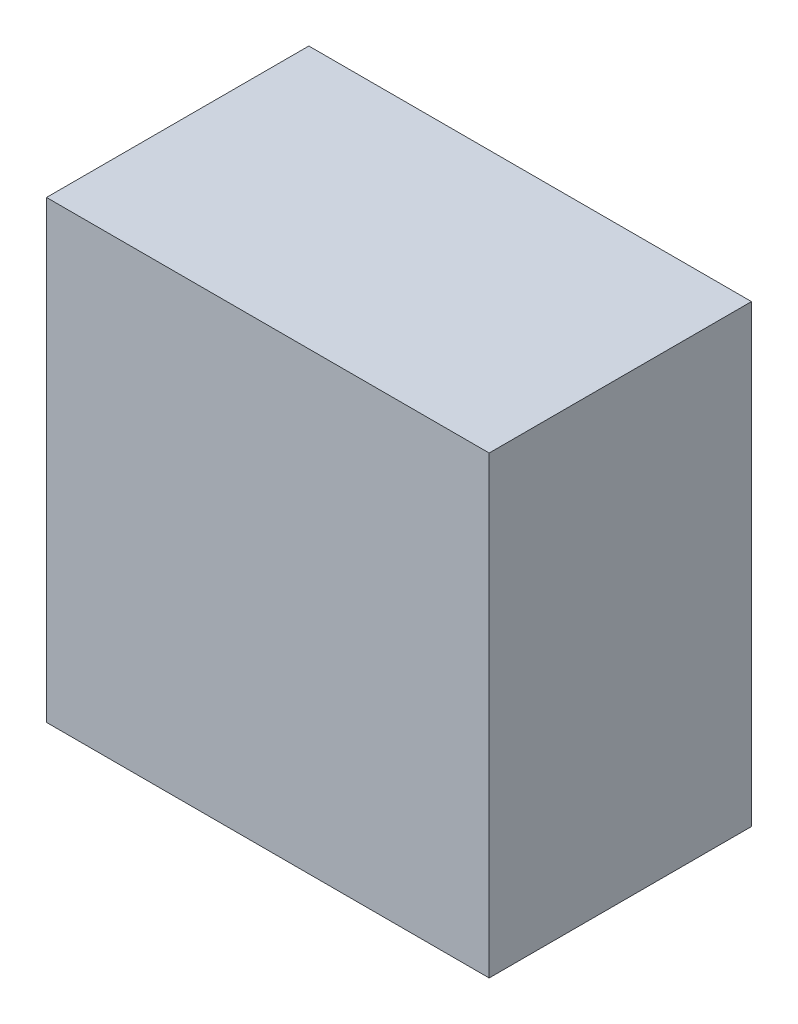
ISO-10303-21;
HEADER;
FILE_DESCRIPTION(('STEP AP214'),'2;1');
FILE_NAME('part.step','',(''),(''),'','','');
FILE_SCHEMA(('AUTOMOTIVE_DESIGN { 1 0 10303 214 1 1 1 1 }'));
ENDSEC;
DATA;
#1=APPLICATION_CONTEXT('core data for automotive mechanical design processes');
#2=APPLICATION_PROTOCOL_DEFINITION('international standard','automotive_design',2000,#1);
#3=PRODUCT_CONTEXT('',#1,'mechanical');
#4=PRODUCT('Part','Part','',(#3));
#5=PRODUCT_RELATED_PRODUCT_CATEGORY('part','',(#4));
#6=PRODUCT_DEFINITION_FORMATION('','',#4);
#7=PRODUCT_DEFINITION_CONTEXT('part definition',#1,'design');
#8=PRODUCT_DEFINITION('design','',#6,#7);
#9=PRODUCT_DEFINITION_SHAPE('','',#8);
#10=(LENGTH_UNIT() NAMED_UNIT(*) SI_UNIT(.MILLI.,.METRE.));
#11=(NAMED_UNIT(*) PLANE_ANGLE_UNIT() SI_UNIT($,.RADIAN.));
#12=(NAMED_UNIT(*) SI_UNIT($,.STERADIAN.) SOLID_ANGLE_UNIT());
#13=UNCERTAINTY_MEASURE_WITH_UNIT(LENGTH_MEASURE(1.E-05),#10,'distance_accuracy_value','');
#14=(GEOMETRIC_REPRESENTATION_CONTEXT(3) GLOBAL_UNCERTAINTY_ASSIGNED_CONTEXT((#13)) GLOBAL_UNIT_ASSIGNED_CONTEXT((#10,
#11,#12)) REPRESENTATION_CONTEXT('',''));
#15=CARTESIAN_POINT('',(0.,0.,0.));
#16=DIRECTION('',(0.,0.,1.));
#17=DIRECTION('',(1.,0.,0.));
#18=AXIS2_PLACEMENT_3D('',#15,#16,#17);
#19=CARTESIAN_POINT('',(-12.6565299729009,0.,15.));
#20=DIRECTION('',(1.,0.,0.));
#21=DIRECTION('',(0.,0.,-1.));
#22=AXIS2_PLACEMENT_3D('',#19,#20,#21);
#23=PLANE('',#22);
#24=DIRECTION('',(0.,-1.,0.));
#25=VECTOR('',#24,1.);
#26=CARTESIAN_POINT('',(-12.6565299729009,0.,0.));
#27=LINE('',#26,#25);
#28=CARTESIAN_POINT('',(-12.6565299729009,26.,0.));
#29=VERTEX_POINT('',#28);
#30=CARTESIAN_POINT('',(-12.6565299729009,0.,0.));
#31=VERTEX_POINT('',#30);
#32=EDGE_CURVE('E97',#29,#31,#27,.T.);
#33=ORIENTED_EDGE('',*,*,#32,.T.);
#34=DIRECTION('',(0.,0.,-1.));
#35=VECTOR('',#34,1.);
#36=CARTESIAN_POINT('',(-12.6565299729009,0.,15.));
#37=LINE('',#36,#35);
#38=CARTESIAN_POINT('',(-12.6565299729009,0.,15.));
#39=VERTEX_POINT('',#38);
#40=EDGE_CURVE('E11',#39,#31,#37,.T.);
#41=ORIENTED_EDGE('',*,*,#40,.F.);
#42=DIRECTION('',(0.,-1.,0.));
#43=VECTOR('',#42,1.);
#44=CARTESIAN_POINT('',(-12.6565299729009,0.,15.));
#45=LINE('',#44,#43);
#46=CARTESIAN_POINT('',(-12.6565299729009,26.,15.));
#47=VERTEX_POINT('',#46);
#48=EDGE_CURVE('E85',#47,#39,#45,.T.);
#49=ORIENTED_EDGE('',*,*,#48,.F.);
#50=DIRECTION('',(0.,0.,-1.));
#51=VECTOR('',#50,1.);
#52=CARTESIAN_POINT('',(-12.6565299729009,26.,15.));
#53=LINE('',#52,#51);
#54=EDGE_CURVE('E93',#47,#29,#53,.T.);
#55=ORIENTED_EDGE('',*,*,#54,.T.);
#56=EDGE_LOOP('',(#33,#41,#49,#55));
#57=FACE_BOUND('',#56,.T.);
#58=ADVANCED_FACE('F34',(#57),#23,.F.);
#59=CARTESIAN_POINT('',(12.6565299729009,0.,15.));
#60=DIRECTION('',(0.,1.,0.));
#61=DIRECTION('',(0.,0.,1.));
#62=AXIS2_PLACEMENT_3D('',#59,#60,#61);
#63=PLANE('',#62);
#64=DIRECTION('',(1.,0.,0.));
#65=VECTOR('',#64,1.);
#66=CARTESIAN_POINT('',(12.6565299729009,0.,0.));
#67=LINE('',#66,#65);
#68=CARTESIAN_POINT('',(12.6565299729009,0.,0.));
#69=VERTEX_POINT('',#68);
#70=EDGE_CURVE('E89',#31,#69,#67,.T.);
#71=ORIENTED_EDGE('',*,*,#70,.T.);
#72=DIRECTION('',(0.,0.,-1.));
#73=VECTOR('',#72,1.);
#74=CARTESIAN_POINT('',(12.6565299729009,0.,15.));
#75=LINE('',#74,#73);
#76=CARTESIAN_POINT('',(12.6565299729009,0.,15.));
#77=VERTEX_POINT('',#76);
#78=EDGE_CURVE('E42',#77,#69,#75,.T.);
#79=ORIENTED_EDGE('',*,*,#78,.F.);
#80=DIRECTION('',(1.,0.,0.));
#81=VECTOR('',#80,1.);
#82=CARTESIAN_POINT('',(12.6565299729009,0.,15.));
#83=LINE('',#82,#81);
#84=EDGE_CURVE('E80',#39,#77,#83,.T.);
#85=ORIENTED_EDGE('',*,*,#84,.F.);
#86=ORIENTED_EDGE('',*,*,#40,.T.);
#87=EDGE_LOOP('',(#71,#79,#85,#86));
#88=FACE_BOUND('',#87,.T.);
#89=ADVANCED_FACE('F88',(#88),#63,.F.);
#90=CARTESIAN_POINT('',(12.6565299729009,0.,15.));
#91=DIRECTION('',(-1.,0.,0.));
#92=DIRECTION('',(0.,0.,1.));
#93=AXIS2_PLACEMENT_3D('',#90,#91,#92);
#94=PLANE('',#93);
#95=DIRECTION('',(0.,1.,0.));
#96=VECTOR('',#95,1.);
#97=CARTESIAN_POINT('',(12.6565299729009,0.,0.));
#98=LINE('',#97,#96);
#99=CARTESIAN_POINT('',(12.6565299729009,26.,0.));
#100=VERTEX_POINT('',#99);
#101=EDGE_CURVE('E67',#69,#100,#98,.T.);
#102=ORIENTED_EDGE('',*,*,#101,.T.);
#103=DIRECTION('',(0.,0.,-1.));
#104=VECTOR('',#103,1.);
#105=CARTESIAN_POINT('',(12.6565299729009,26.,15.));
#106=LINE('',#105,#104);
#107=CARTESIAN_POINT('',(12.6565299729009,26.,15.));
#108=VERTEX_POINT('',#107);
#109=EDGE_CURVE('E90',#108,#100,#106,.T.);
#110=ORIENTED_EDGE('',*,*,#109,.F.);
#111=DIRECTION('',(0.,1.,0.));
#112=VECTOR('',#111,1.);
#113=CARTESIAN_POINT('',(12.6565299729009,0.,15.));
#114=LINE('',#113,#112);
#115=EDGE_CURVE('E83',#77,#108,#114,.T.);
#116=ORIENTED_EDGE('',*,*,#115,.F.);
#117=ORIENTED_EDGE('',*,*,#78,.T.);
#118=EDGE_LOOP('',(#102,#110,#116,#117));
#119=FACE_BOUND('',#118,.T.);
#120=ADVANCED_FACE('F91',(#119),#94,.F.);
#121=CARTESIAN_POINT('',(12.6565299729009,26.,15.));
#122=DIRECTION('',(0.,-1.,0.));
#123=DIRECTION('',(0.,0.,-1.));
#124=AXIS2_PLACEMENT_3D('',#121,#122,#123);
#125=PLANE('',#124);
#126=DIRECTION('',(-1.,0.,0.));
#127=VECTOR('',#126,1.);
#128=CARTESIAN_POINT('',(12.6565299729009,26.,0.));
#129=LINE('',#128,#127);
#130=EDGE_CURVE('E73',#100,#29,#129,.T.);
#131=ORIENTED_EDGE('',*,*,#130,.T.);
#132=ORIENTED_EDGE('',*,*,#54,.F.);
#133=DIRECTION('',(-1.,0.,0.));
#134=VECTOR('',#133,1.);
#135=CARTESIAN_POINT('',(12.6565299729009,26.,15.));
#136=LINE('',#135,#134);
#137=EDGE_CURVE('E50',#108,#47,#136,.T.);
#138=ORIENTED_EDGE('',*,*,#137,.F.);
#139=ORIENTED_EDGE('',*,*,#109,.T.);
#140=EDGE_LOOP('',(#131,#132,#138,#139));
#141=FACE_BOUND('',#140,.T.);
#142=ADVANCED_FACE('F104',(#141),#125,.F.);
#143=CARTESIAN_POINT('',(-12.6565299729009,26.,15.));
#144=DIRECTION('',(0.,0.,1.));
#145=DIRECTION('',(1.,0.,0.));
#146=AXIS2_PLACEMENT_3D('',#143,#144,#145);
#147=PLANE('',#146);
#148=ORIENTED_EDGE('',*,*,#48,.T.);
#149=ORIENTED_EDGE('',*,*,#84,.T.);
#150=ORIENTED_EDGE('',*,*,#115,.T.);
#151=ORIENTED_EDGE('',*,*,#137,.T.);
#152=EDGE_LOOP('',(#148,#149,#150,#151));
#153=FACE_BOUND('',#152,.T.);
#154=ADVANCED_FACE('F81',(#153),#147,.T.);
#155=CARTESIAN_POINT('',(-12.6565299729009,26.,0.));
#156=DIRECTION('',(0.,0.,1.));
#157=DIRECTION('',(1.,0.,0.));
#158=AXIS2_PLACEMENT_3D('',#155,#156,#157);
#159=PLANE('',#158);
#160=ORIENTED_EDGE('',*,*,#32,.F.);
#161=ORIENTED_EDGE('',*,*,#130,.F.);
#162=ORIENTED_EDGE('',*,*,#101,.F.);
#163=ORIENTED_EDGE('',*,*,#70,.F.);
#164=EDGE_LOOP('',(#160,#161,#162,#163));
#165=FACE_BOUND('',#164,.T.);
#166=ADVANCED_FACE('F107',(#165),#159,.F.);
#167=CLOSED_SHELL('',(#58,#89,#120,#142,#154,#166));
#168=MANIFOLD_SOLID_BREP('B2',#167);
#169=ADVANCED_BREP_SHAPE_REPRESENTATION('',(#18,#168),#14);
#170=SHAPE_DEFINITION_REPRESENTATION(#9,#169);
ENDSEC;
END-ISO-10303-21;
